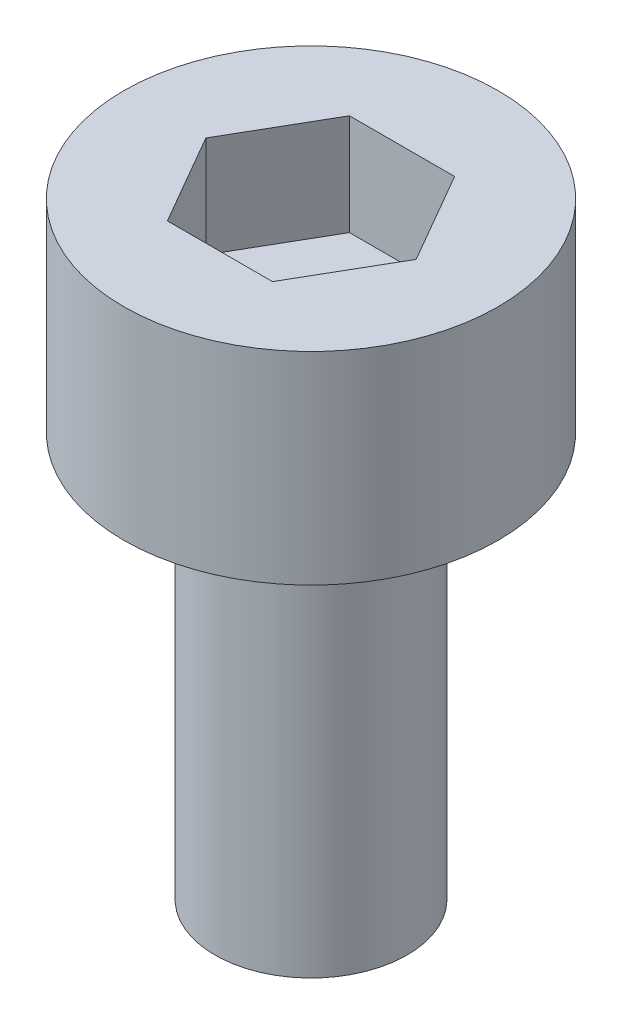
ISO-10303-21;
HEADER;
FILE_DESCRIPTION(('STEP AP214'),'2;1');
FILE_NAME('part.step','',(''),(''),'','','');
FILE_SCHEMA(('AUTOMOTIVE_DESIGN { 1 0 10303 214 1 1 1 1 }'));
ENDSEC;
DATA;
#1=APPLICATION_CONTEXT('core data for automotive mechanical design processes');
#2=APPLICATION_PROTOCOL_DEFINITION('international standard','automotive_design',2000,#1);
#3=PRODUCT_CONTEXT('',#1,'mechanical');
#4=PRODUCT('Part','Part','',(#3));
#5=PRODUCT_RELATED_PRODUCT_CATEGORY('part','',(#4));
#6=PRODUCT_DEFINITION_FORMATION('','',#4);
#7=PRODUCT_DEFINITION_CONTEXT('part definition',#1,'design');
#8=PRODUCT_DEFINITION('design','',#6,#7);
#9=PRODUCT_DEFINITION_SHAPE('','',#8);
#10=(LENGTH_UNIT() NAMED_UNIT(*) SI_UNIT(.MILLI.,.METRE.));
#11=(NAMED_UNIT(*) PLANE_ANGLE_UNIT() SI_UNIT($,.RADIAN.));
#12=(NAMED_UNIT(*) SI_UNIT($,.STERADIAN.) SOLID_ANGLE_UNIT());
#13=UNCERTAINTY_MEASURE_WITH_UNIT(LENGTH_MEASURE(1.E-05),#10,'distance_accuracy_value','');
#14=(GEOMETRIC_REPRESENTATION_CONTEXT(3) GLOBAL_UNCERTAINTY_ASSIGNED_CONTEXT((#13)) GLOBAL_UNIT_ASSIGNED_CONTEXT((#10,
#11,#12)) REPRESENTATION_CONTEXT('',''));
#15=CARTESIAN_POINT('',(0.,0.,0.));
#16=DIRECTION('',(0.,0.,1.));
#17=DIRECTION('',(1.,0.,0.));
#18=AXIS2_PLACEMENT_3D('',#15,#16,#17);
#19=CARTESIAN_POINT('',(0.,2.,0.));
#20=DIRECTION('',(0.,-1.,0.));
#21=DIRECTION('',(0.,0.,-1.));
#22=AXIS2_PLACEMENT_3D('',#19,#20,#21);
#23=CYLINDRICAL_SURFACE('',#22,1.85);
#24=CARTESIAN_POINT('',(0.,2.,0.));
#25=DIRECTION('',(0.,1.,0.));
#26=DIRECTION('',(0.,0.,1.));
#27=AXIS2_PLACEMENT_3D('',#24,#25,#26);
#28=CIRCLE('',#27,1.85);
#29=CARTESIAN_POINT('',(0.,2.,1.85));
#30=VERTEX_POINT('',#29);
#31=EDGE_CURVE('E54',#30,#30,#28,.T.);
#32=ORIENTED_EDGE('',*,*,#31,.F.);
#33=EDGE_LOOP('',(#32));
#34=FACE_BOUND('',#33,.T.);
#35=CARTESIAN_POINT('',(0.,0.,0.));
#36=DIRECTION('',(0.,1.,0.));
#37=DIRECTION('',(0.,0.,1.));
#38=AXIS2_PLACEMENT_3D('',#35,#36,#37);
#39=CIRCLE('',#38,1.85);
#40=CARTESIAN_POINT('',(0.,0.,1.85));
#41=VERTEX_POINT('',#40);
#42=EDGE_CURVE('E48',#41,#41,#39,.T.);
#43=ORIENTED_EDGE('',*,*,#42,.T.);
#44=EDGE_LOOP('',(#43));
#45=FACE_BOUND('',#44,.T.);
#46=ADVANCED_FACE('F45',(#34,#45),#23,.T.);
#47=CARTESIAN_POINT('',(0.,2.,0.));
#48=DIRECTION('',(0.,1.,0.));
#49=DIRECTION('',(0.,0.,1.));
#50=AXIS2_PLACEMENT_3D('',#47,#48,#49);
#51=PLANE('',#50);
#52=DIRECTION('',(0.5,0.,-0.866025403784439));
#53=VECTOR('',#52,1.);
#54=CARTESIAN_POINT('',(0.519615242270663,2.,0.9));
#55=LINE('',#54,#53);
#56=CARTESIAN_POINT('',(0.519615242270663,2.,0.9));
#57=VERTEX_POINT('',#56);
#58=CARTESIAN_POINT('',(1.03923048454133,2.,0.));
#59=VERTEX_POINT('',#58);
#60=EDGE_CURVE('E62',#57,#59,#55,.T.);
#61=ORIENTED_EDGE('',*,*,#60,.F.);
#62=DIRECTION('',(1.,0.,0.));
#63=VECTOR('',#62,1.);
#64=CARTESIAN_POINT('',(-0.519615242270663,2.,0.9));
#65=LINE('',#64,#63);
#66=CARTESIAN_POINT('',(-0.519615242270663,2.,0.9));
#67=VERTEX_POINT('',#66);
#68=EDGE_CURVE('E156',#67,#57,#65,.T.);
#69=ORIENTED_EDGE('',*,*,#68,.F.);
#70=DIRECTION('',(0.5,0.,0.866025403784439));
#71=VECTOR('',#70,1.);
#72=CARTESIAN_POINT('',(-1.03923048454133,2.,0.));
#73=LINE('',#72,#71);
#74=CARTESIAN_POINT('',(-1.03923048454133,2.,0.));
#75=VERTEX_POINT('',#74);
#76=EDGE_CURVE('E153',#75,#67,#73,.T.);
#77=ORIENTED_EDGE('',*,*,#76,.F.);
#78=DIRECTION('',(-0.5,0.,0.866025403784438));
#79=VECTOR('',#78,1.);
#80=CARTESIAN_POINT('',(-0.519615242270663,2.,-0.9));
#81=LINE('',#80,#79);
#82=CARTESIAN_POINT('',(-0.519615242270663,2.,-0.9));
#83=VERTEX_POINT('',#82);
#84=EDGE_CURVE('E110',#83,#75,#81,.T.);
#85=ORIENTED_EDGE('',*,*,#84,.F.);
#86=DIRECTION('',(-1.,0.,0.));
#87=VECTOR('',#86,1.);
#88=CARTESIAN_POINT('',(0.519615242270663,2.,-0.9));
#89=LINE('',#88,#87);
#90=CARTESIAN_POINT('',(0.519615242270663,2.,-0.9));
#91=VERTEX_POINT('',#90);
#92=EDGE_CURVE('E147',#91,#83,#89,.T.);
#93=ORIENTED_EDGE('',*,*,#92,.F.);
#94=DIRECTION('',(-0.5,0.,-0.866025403784439));
#95=VECTOR('',#94,1.);
#96=CARTESIAN_POINT('',(1.03923048454133,2.,0.));
#97=LINE('',#96,#95);
#98=EDGE_CURVE('E142',#59,#91,#97,.T.);
#99=ORIENTED_EDGE('',*,*,#98,.F.);
#100=EDGE_LOOP('',(#61,#69,#77,#85,#93,#99));
#101=FACE_BOUND('',#100,.T.);
#102=ORIENTED_EDGE('',*,*,#31,.T.);
#103=EDGE_LOOP('',(#102));
#104=FACE_BOUND('',#103,.T.);
#105=ADVANCED_FACE('F182',(#101,#104),#51,.T.);
#106=CARTESIAN_POINT('',(0.,0.,0.));
#107=DIRECTION('',(0.,1.,0.));
#108=DIRECTION('',(0.,0.,1.));
#109=AXIS2_PLACEMENT_3D('',#106,#107,#108);
#110=PLANE('',#109);
#111=CARTESIAN_POINT('',(0.,0.,0.));
#112=DIRECTION('',(0.,-1.,0.));
#113=DIRECTION('',(0.,0.,-1.));
#114=AXIS2_PLACEMENT_3D('',#111,#112,#113);
#115=CIRCLE('',#114,0.95);
#116=CARTESIAN_POINT('',(0.,0.,-0.95));
#117=VERTEX_POINT('',#116);
#118=EDGE_CURVE('E11',#117,#117,#115,.T.);
#119=ORIENTED_EDGE('',*,*,#118,.F.);
#120=EDGE_LOOP('',(#119));
#121=FACE_BOUND('',#120,.T.);
#122=ORIENTED_EDGE('',*,*,#42,.F.);
#123=EDGE_LOOP('',(#122));
#124=FACE_BOUND('',#123,.T.);
#125=ADVANCED_FACE('F179',(#121,#124),#110,.F.);
#126=CARTESIAN_POINT('',(0.519615242270663,1.,0.9));
#127=DIRECTION('',(0.866025403784439,0.,0.5));
#128=DIRECTION('',(0.5,0.,-0.866025403784439));
#129=AXIS2_PLACEMENT_3D('',#126,#127,#128);
#130=PLANE('',#129);
#131=ORIENTED_EDGE('',*,*,#60,.T.);
#132=DIRECTION('',(0.,1.,0.));
#133=VECTOR('',#132,1.);
#134=CARTESIAN_POINT('',(1.03923048454133,1.,0.));
#135=LINE('',#134,#133);
#136=CARTESIAN_POINT('',(1.03923048454133,1.,0.));
#137=VERTEX_POINT('',#136);
#138=EDGE_CURVE('E92',#137,#59,#135,.T.);
#139=ORIENTED_EDGE('',*,*,#138,.F.);
#140=DIRECTION('',(0.5,0.,-0.866025403784439));
#141=VECTOR('',#140,1.);
#142=CARTESIAN_POINT('',(0.519615242270663,1.,0.9));
#143=LINE('',#142,#141);
#144=CARTESIAN_POINT('',(0.519615242270663,1.,0.9));
#145=VERTEX_POINT('',#144);
#146=EDGE_CURVE('E159',#145,#137,#143,.T.);
#147=ORIENTED_EDGE('',*,*,#146,.F.);
#148=DIRECTION('',(0.,1.,0.));
#149=VECTOR('',#148,1.);
#150=CARTESIAN_POINT('',(0.519615242270663,1.,0.9));
#151=LINE('',#150,#149);
#152=EDGE_CURVE('E70',#145,#57,#151,.T.);
#153=ORIENTED_EDGE('',*,*,#152,.T.);
#154=EDGE_LOOP('',(#131,#139,#147,#153));
#155=FACE_BOUND('',#154,.T.);
#156=ADVANCED_FACE('F181',(#155),#130,.F.);
#157=CARTESIAN_POINT('',(-0.519615242270663,1.,0.9));
#158=DIRECTION('',(0.,0.,1.));
#159=DIRECTION('',(1.,0.,0.));
#160=AXIS2_PLACEMENT_3D('',#157,#158,#159);
#161=PLANE('',#160);
#162=ORIENTED_EDGE('',*,*,#68,.T.);
#163=ORIENTED_EDGE('',*,*,#152,.F.);
#164=DIRECTION('',(1.,0.,0.));
#165=VECTOR('',#164,1.);
#166=CARTESIAN_POINT('',(-0.519615242270663,1.,0.9));
#167=LINE('',#166,#165);
#168=CARTESIAN_POINT('',(-0.519615242270663,1.,0.9));
#169=VERTEX_POINT('',#168);
#170=EDGE_CURVE('E124',#169,#145,#167,.T.);
#171=ORIENTED_EDGE('',*,*,#170,.F.);
#172=DIRECTION('',(0.,1.,0.));
#173=VECTOR('',#172,1.);
#174=CARTESIAN_POINT('',(-0.519615242270663,1.,0.9));
#175=LINE('',#174,#173);
#176=EDGE_CURVE('E115',#169,#67,#175,.T.);
#177=ORIENTED_EDGE('',*,*,#176,.T.);
#178=EDGE_LOOP('',(#162,#163,#171,#177));
#179=FACE_BOUND('',#178,.T.);
#180=ADVANCED_FACE('F189',(#179),#161,.F.);
#181=CARTESIAN_POINT('',(-1.03923048454133,1.,0.));
#182=DIRECTION('',(-0.866025403784439,0.,0.5));
#183=DIRECTION('',(0.5,0.,0.866025403784439));
#184=AXIS2_PLACEMENT_3D('',#181,#182,#183);
#185=PLANE('',#184);
#186=ORIENTED_EDGE('',*,*,#76,.T.);
#187=ORIENTED_EDGE('',*,*,#176,.F.);
#188=DIRECTION('',(0.5,0.,0.866025403784439));
#189=VECTOR('',#188,1.);
#190=CARTESIAN_POINT('',(-1.03923048454133,1.,0.));
#191=LINE('',#190,#189);
#192=CARTESIAN_POINT('',(-1.03923048454133,1.,0.));
#193=VERTEX_POINT('',#192);
#194=EDGE_CURVE('E119',#193,#169,#191,.T.);
#195=ORIENTED_EDGE('',*,*,#194,.F.);
#196=DIRECTION('',(0.,1.,0.));
#197=VECTOR('',#196,1.);
#198=CARTESIAN_POINT('',(-1.03923048454133,1.,0.));
#199=LINE('',#198,#197);
#200=EDGE_CURVE('E103',#193,#75,#199,.T.);
#201=ORIENTED_EDGE('',*,*,#200,.T.);
#202=EDGE_LOOP('',(#186,#187,#195,#201));
#203=FACE_BOUND('',#202,.T.);
#204=ADVANCED_FACE('F120',(#203),#185,.F.);
#205=CARTESIAN_POINT('',(-0.519615242270663,1.,-0.9));
#206=DIRECTION('',(-0.866025403784439,0.,-0.5));
#207=DIRECTION('',(-0.5,0.,0.866025403784438));
#208=AXIS2_PLACEMENT_3D('',#205,#206,#207);
#209=PLANE('',#208);
#210=ORIENTED_EDGE('',*,*,#84,.T.);
#211=ORIENTED_EDGE('',*,*,#200,.F.);
#212=DIRECTION('',(-0.5,0.,0.866025403784438));
#213=VECTOR('',#212,1.);
#214=CARTESIAN_POINT('',(-0.519615242270663,1.,-0.9));
#215=LINE('',#214,#213);
#216=CARTESIAN_POINT('',(-0.519615242270663,1.,-0.9));
#217=VERTEX_POINT('',#216);
#218=EDGE_CURVE('E107',#217,#193,#215,.T.);
#219=ORIENTED_EDGE('',*,*,#218,.F.);
#220=DIRECTION('',(0.,1.,0.));
#221=VECTOR('',#220,1.);
#222=CARTESIAN_POINT('',(-0.519615242270663,1.,-0.9));
#223=LINE('',#222,#221);
#224=EDGE_CURVE('E116',#217,#83,#223,.T.);
#225=ORIENTED_EDGE('',*,*,#224,.T.);
#226=EDGE_LOOP('',(#210,#211,#219,#225));
#227=FACE_BOUND('',#226,.T.);
#228=ADVANCED_FACE('F105',(#227),#209,.F.);
#229=CARTESIAN_POINT('',(0.519615242270663,1.,-0.9));
#230=DIRECTION('',(0.,0.,-1.));
#231=DIRECTION('',(-1.,0.,0.));
#232=AXIS2_PLACEMENT_3D('',#229,#230,#231);
#233=PLANE('',#232);
#234=ORIENTED_EDGE('',*,*,#92,.T.);
#235=ORIENTED_EDGE('',*,*,#224,.F.);
#236=DIRECTION('',(-1.,0.,0.));
#237=VECTOR('',#236,1.);
#238=CARTESIAN_POINT('',(0.519615242270663,1.,-0.9));
#239=LINE('',#238,#237);
#240=CARTESIAN_POINT('',(0.519615242270663,1.,-0.9));
#241=VERTEX_POINT('',#240);
#242=EDGE_CURVE('E130',#241,#217,#239,.T.);
#243=ORIENTED_EDGE('',*,*,#242,.F.);
#244=DIRECTION('',(0.,1.,0.));
#245=VECTOR('',#244,1.);
#246=CARTESIAN_POINT('',(0.519615242270663,1.,-0.9));
#247=LINE('',#246,#245);
#248=EDGE_CURVE('E166',#241,#91,#247,.T.);
#249=ORIENTED_EDGE('',*,*,#248,.T.);
#250=EDGE_LOOP('',(#234,#235,#243,#249));
#251=FACE_BOUND('',#250,.T.);
#252=ADVANCED_FACE('F230',(#251),#233,.F.);
#253=CARTESIAN_POINT('',(1.03923048454133,1.,0.));
#254=DIRECTION('',(0.866025403784439,0.,-0.5));
#255=DIRECTION('',(-0.5,0.,-0.866025403784439));
#256=AXIS2_PLACEMENT_3D('',#253,#254,#255);
#257=PLANE('',#256);
#258=ORIENTED_EDGE('',*,*,#98,.T.);
#259=ORIENTED_EDGE('',*,*,#248,.F.);
#260=DIRECTION('',(-0.5,0.,-0.866025403784439));
#261=VECTOR('',#260,1.);
#262=CARTESIAN_POINT('',(1.03923048454133,1.,0.));
#263=LINE('',#262,#261);
#264=EDGE_CURVE('E134',#137,#241,#263,.T.);
#265=ORIENTED_EDGE('',*,*,#264,.F.);
#266=ORIENTED_EDGE('',*,*,#138,.T.);
#267=EDGE_LOOP('',(#258,#259,#265,#266));
#268=FACE_BOUND('',#267,.T.);
#269=ADVANCED_FACE('F238',(#268),#257,.F.);
#270=CARTESIAN_POINT('',(0.,1.,0.));
#271=DIRECTION('',(0.,1.,0.));
#272=DIRECTION('',(0.,0.,1.));
#273=AXIS2_PLACEMENT_3D('',#270,#271,#272);
#274=PLANE('',#273);
#275=ORIENTED_EDGE('',*,*,#146,.T.);
#276=ORIENTED_EDGE('',*,*,#264,.T.);
#277=ORIENTED_EDGE('',*,*,#242,.T.);
#278=ORIENTED_EDGE('',*,*,#218,.T.);
#279=ORIENTED_EDGE('',*,*,#194,.T.);
#280=ORIENTED_EDGE('',*,*,#170,.T.);
#281=EDGE_LOOP('',(#275,#276,#277,#278,#279,#280));
#282=FACE_BOUND('',#281,.T.);
#283=ADVANCED_FACE('F127',(#282),#274,.T.);
#284=CARTESIAN_POINT('',(0.,-4.,0.));
#285=DIRECTION('',(0.,1.,0.));
#286=DIRECTION('',(0.,0.,1.));
#287=AXIS2_PLACEMENT_3D('',#284,#285,#286);
#288=CYLINDRICAL_SURFACE('',#287,0.95);
#289=CARTESIAN_POINT('',(0.,-4.,0.));
#290=DIRECTION('',(0.,-1.,0.));
#291=DIRECTION('',(0.,0.,-1.));
#292=AXIS2_PLACEMENT_3D('',#289,#290,#291);
#293=CIRCLE('',#292,0.95);
#294=CARTESIAN_POINT('',(0.,-4.,-0.95));
#295=VERTEX_POINT('',#294);
#296=EDGE_CURVE('E143',#295,#295,#293,.T.);
#297=ORIENTED_EDGE('',*,*,#296,.F.);
#298=EDGE_LOOP('',(#297));
#299=FACE_BOUND('',#298,.T.);
#300=ORIENTED_EDGE('',*,*,#118,.T.);
#301=EDGE_LOOP('',(#300));
#302=FACE_BOUND('',#301,.T.);
#303=ADVANCED_FACE('F253',(#299,#302),#288,.T.);
#304=CARTESIAN_POINT('',(0.,-4.,0.));
#305=DIRECTION('',(0.,-1.,0.));
#306=DIRECTION('',(0.,0.,-1.));
#307=AXIS2_PLACEMENT_3D('',#304,#305,#306);
#308=PLANE('',#307);
#309=ORIENTED_EDGE('',*,*,#296,.T.);
#310=EDGE_LOOP('',(#309));
#311=FACE_BOUND('',#310,.T.);
#312=ADVANCED_FACE('F264',(#311),#308,.T.);
#313=CLOSED_SHELL('',(#46,#105,#125,#156,#180,#204,#228,#252,#269,#283,#303,#312));
#314=MANIFOLD_SOLID_BREP('B2',#313);
#315=ADVANCED_BREP_SHAPE_REPRESENTATION('',(#18,#314),#14);
#316=SHAPE_DEFINITION_REPRESENTATION(#9,#315);
ENDSEC;
END-ISO-10303-21;
